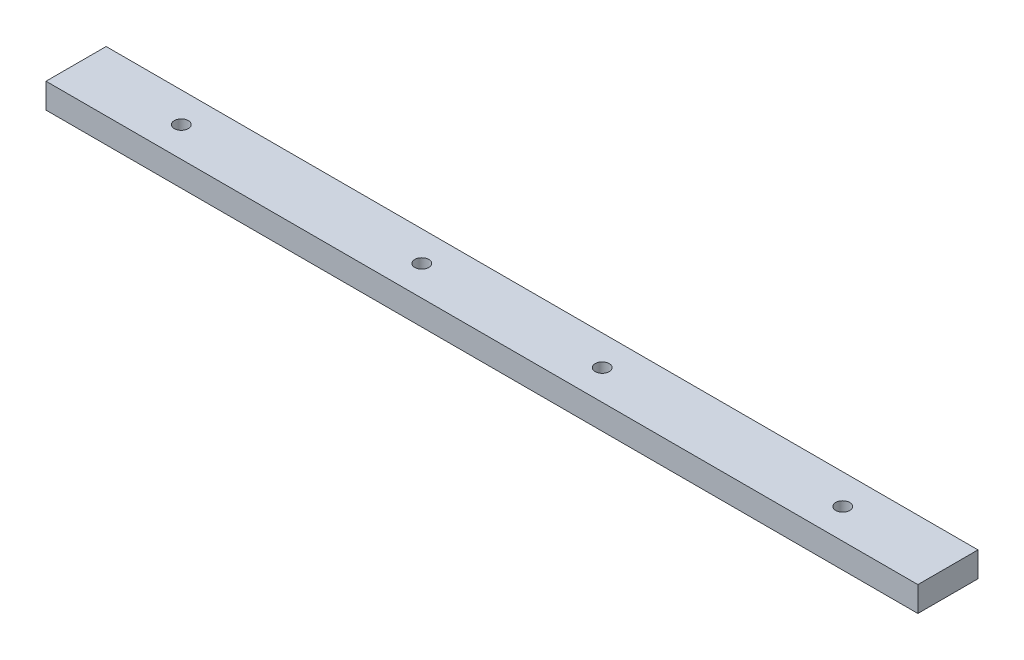
ISO-10303-21;
HEADER;
FILE_DESCRIPTION(('STEP AP214'),'2;1');
FILE_NAME('part.step','',(''),(''),'','','');
FILE_SCHEMA(('AUTOMOTIVE_DESIGN { 1 0 10303 214 1 1 1 1 }'));
ENDSEC;
DATA;
#1=APPLICATION_CONTEXT('core data for automotive mechanical design processes');
#2=APPLICATION_PROTOCOL_DEFINITION('international standard','automotive_design',2000,#1);
#3=PRODUCT_CONTEXT('',#1,'mechanical');
#4=PRODUCT('Part','Part','',(#3));
#5=PRODUCT_RELATED_PRODUCT_CATEGORY('part','',(#4));
#6=PRODUCT_DEFINITION_FORMATION('','',#4);
#7=PRODUCT_DEFINITION_CONTEXT('part definition',#1,'design');
#8=PRODUCT_DEFINITION('design','',#6,#7);
#9=PRODUCT_DEFINITION_SHAPE('','',#8);
#10=(LENGTH_UNIT() NAMED_UNIT(*) SI_UNIT(.MILLI.,.METRE.));
#11=(NAMED_UNIT(*) PLANE_ANGLE_UNIT() SI_UNIT($,.RADIAN.));
#12=(NAMED_UNIT(*) SI_UNIT($,.STERADIAN.) SOLID_ANGLE_UNIT());
#13=UNCERTAINTY_MEASURE_WITH_UNIT(LENGTH_MEASURE(1.E-05),#10,'distance_accuracy_value','');
#14=(GEOMETRIC_REPRESENTATION_CONTEXT(3) GLOBAL_UNCERTAINTY_ASSIGNED_CONTEXT((#13)) GLOBAL_UNIT_ASSIGNED_CONTEXT((#10,
#11,#12)) REPRESENTATION_CONTEXT('',''));
#15=CARTESIAN_POINT('',(0.,0.,0.));
#16=DIRECTION('',(0.,0.,1.));
#17=DIRECTION('',(1.,0.,0.));
#18=AXIS2_PLACEMENT_3D('',#15,#16,#17);
#19=CARTESIAN_POINT('',(0.,5.,0.));
#20=DIRECTION('',(0.,1.,0.));
#21=DIRECTION('',(0.,0.,1.));
#22=AXIS2_PLACEMENT_3D('',#19,#20,#21);
#23=PLANE('',#22);
#24=CARTESIAN_POINT('',(18.,5.,0.));
#25=DIRECTION('',(0.,1.,0.));
#26=DIRECTION('',(0.,0.,1.));
#27=AXIS2_PLACEMENT_3D('',#24,#25,#26);
#28=CIRCLE('',#27,1.4);
#29=CARTESIAN_POINT('',(18.,5.,1.39999999999999));
#30=VERTEX_POINT('',#29);
#31=EDGE_CURVE('E142',#30,#30,#28,.T.);
#32=ORIENTED_EDGE('',*,*,#31,.F.);
#33=EDGE_LOOP('',(#32));
#34=FACE_BOUND('',#33,.T.);
#35=CARTESIAN_POINT('',(-66.,5.,0.));
#36=DIRECTION('',(0.,1.,0.));
#37=DIRECTION('',(0.,0.,1.));
#38=AXIS2_PLACEMENT_3D('',#35,#36,#37);
#39=CIRCLE('',#38,1.4);
#40=CARTESIAN_POINT('',(-66.,5.,1.4));
#41=VERTEX_POINT('',#40);
#42=EDGE_CURVE('E112',#41,#41,#39,.T.);
#43=ORIENTED_EDGE('',*,*,#42,.F.);
#44=EDGE_LOOP('',(#43));
#45=FACE_BOUND('',#44,.T.);
#46=DIRECTION('',(0.,0.,-1.));
#47=VECTOR('',#46,1.);
#48=CARTESIAN_POINT('',(87.,5.,-6.));
#49=LINE('',#48,#47);
#50=CARTESIAN_POINT('',(87.,5.,6.));
#51=VERTEX_POINT('',#50);
#52=CARTESIAN_POINT('',(87.,5.,-6.));
#53=VERTEX_POINT('',#52);
#54=EDGE_CURVE('E92',#51,#53,#49,.T.);
#55=ORIENTED_EDGE('',*,*,#54,.T.);
#56=DIRECTION('',(-1.,0.,0.));
#57=VECTOR('',#56,1.);
#58=CARTESIAN_POINT('',(-87.,5.,-6.));
#59=LINE('',#58,#57);
#60=CARTESIAN_POINT('',(-87.,5.,-6.));
#61=VERTEX_POINT('',#60);
#62=EDGE_CURVE('E87',#53,#61,#59,.T.);
#63=ORIENTED_EDGE('',*,*,#62,.T.);
#64=DIRECTION('',(0.,0.,1.));
#65=VECTOR('',#64,1.);
#66=CARTESIAN_POINT('',(-87.,5.,-6.));
#67=LINE('',#66,#65);
#68=CARTESIAN_POINT('',(-87.,5.,6.));
#69=VERTEX_POINT('',#68);
#70=EDGE_CURVE('E90',#61,#69,#67,.T.);
#71=ORIENTED_EDGE('',*,*,#70,.T.);
#72=DIRECTION('',(1.,0.,0.));
#73=VECTOR('',#72,1.);
#74=CARTESIAN_POINT('',(-87.,5.,6.));
#75=LINE('',#74,#73);
#76=EDGE_CURVE('E57',#69,#51,#75,.T.);
#77=ORIENTED_EDGE('',*,*,#76,.T.);
#78=EDGE_LOOP('',(#55,#63,#71,#77));
#79=FACE_BOUND('',#78,.T.);
#80=CARTESIAN_POINT('',(-18.,5.,0.));
#81=DIRECTION('',(0.,1.,0.));
#82=DIRECTION('',(0.,0.,1.));
#83=AXIS2_PLACEMENT_3D('',#80,#81,#82);
#84=CIRCLE('',#83,1.4);
#85=CARTESIAN_POINT('',(-18.,5.,1.4));
#86=VERTEX_POINT('',#85);
#87=EDGE_CURVE('E134',#86,#86,#84,.T.);
#88=ORIENTED_EDGE('',*,*,#87,.F.);
#89=EDGE_LOOP('',(#88));
#90=FACE_BOUND('',#89,.T.);
#91=CARTESIAN_POINT('',(66.,5.,0.));
#92=DIRECTION('',(0.,1.,0.));
#93=DIRECTION('',(0.,0.,1.));
#94=AXIS2_PLACEMENT_3D('',#91,#92,#93);
#95=CIRCLE('',#94,1.4);
#96=CARTESIAN_POINT('',(66.,5.,1.4));
#97=VERTEX_POINT('',#96);
#98=EDGE_CURVE('E150',#97,#97,#95,.T.);
#99=ORIENTED_EDGE('',*,*,#98,.F.);
#100=EDGE_LOOP('',(#99));
#101=FACE_BOUND('',#100,.T.);
#102=ADVANCED_FACE('F39',(#34,#45,#79,#90,#101),#23,.T.);
#103=CARTESIAN_POINT('',(0.,0.,0.));
#104=DIRECTION('',(0.,1.,0.));
#105=DIRECTION('',(0.,0.,1.));
#106=AXIS2_PLACEMENT_3D('',#103,#104,#105);
#107=PLANE('',#106);
#108=DIRECTION('',(0.,0.,-1.));
#109=VECTOR('',#108,1.);
#110=CARTESIAN_POINT('',(87.,0.,-6.));
#111=LINE('',#110,#109);
#112=CARTESIAN_POINT('',(87.,0.,6.));
#113=VERTEX_POINT('',#112);
#114=CARTESIAN_POINT('',(87.,0.,-6.));
#115=VERTEX_POINT('',#114);
#116=EDGE_CURVE('E108',#113,#115,#111,.T.);
#117=ORIENTED_EDGE('',*,*,#116,.F.);
#118=DIRECTION('',(1.,0.,0.));
#119=VECTOR('',#118,1.);
#120=CARTESIAN_POINT('',(-87.,0.,6.));
#121=LINE('',#120,#119);
#122=CARTESIAN_POINT('',(-87.,0.,6.));
#123=VERTEX_POINT('',#122);
#124=EDGE_CURVE('E80',#123,#113,#121,.T.);
#125=ORIENTED_EDGE('',*,*,#124,.F.);
#126=DIRECTION('',(0.,0.,1.));
#127=VECTOR('',#126,1.);
#128=CARTESIAN_POINT('',(-87.,0.,-6.));
#129=LINE('',#128,#127);
#130=CARTESIAN_POINT('',(-87.,0.,-6.));
#131=VERTEX_POINT('',#130);
#132=EDGE_CURVE('E74',#131,#123,#129,.T.);
#133=ORIENTED_EDGE('',*,*,#132,.F.);
#134=DIRECTION('',(-1.,0.,0.));
#135=VECTOR('',#134,1.);
#136=CARTESIAN_POINT('',(-87.,0.,-6.));
#137=LINE('',#136,#135);
#138=EDGE_CURVE('E97',#115,#131,#137,.T.);
#139=ORIENTED_EDGE('',*,*,#138,.F.);
#140=EDGE_LOOP('',(#117,#125,#133,#139));
#141=FACE_BOUND('',#140,.T.);
#142=CARTESIAN_POINT('',(-66.,0.,0.));
#143=DIRECTION('',(0.,1.,0.));
#144=DIRECTION('',(0.,0.,1.));
#145=AXIS2_PLACEMENT_3D('',#142,#143,#144);
#146=CIRCLE('',#145,1.4);
#147=CARTESIAN_POINT('',(-66.,0.,1.4));
#148=VERTEX_POINT('',#147);
#149=EDGE_CURVE('E130',#148,#148,#146,.T.);
#150=ORIENTED_EDGE('',*,*,#149,.T.);
#151=EDGE_LOOP('',(#150));
#152=FACE_BOUND('',#151,.T.);
#153=CARTESIAN_POINT('',(-18.,0.,0.));
#154=DIRECTION('',(0.,1.,0.));
#155=DIRECTION('',(0.,0.,1.));
#156=AXIS2_PLACEMENT_3D('',#153,#154,#155);
#157=CIRCLE('',#156,1.4);
#158=CARTESIAN_POINT('',(-18.,0.,1.4));
#159=VERTEX_POINT('',#158);
#160=EDGE_CURVE('E138',#159,#159,#157,.T.);
#161=ORIENTED_EDGE('',*,*,#160,.T.);
#162=EDGE_LOOP('',(#161));
#163=FACE_BOUND('',#162,.T.);
#164=CARTESIAN_POINT('',(18.,0.,0.));
#165=DIRECTION('',(0.,1.,0.));
#166=DIRECTION('',(0.,0.,1.));
#167=AXIS2_PLACEMENT_3D('',#164,#165,#166);
#168=CIRCLE('',#167,1.4);
#169=CARTESIAN_POINT('',(18.,0.,1.39999999999999));
#170=VERTEX_POINT('',#169);
#171=EDGE_CURVE('E146',#170,#170,#168,.T.);
#172=ORIENTED_EDGE('',*,*,#171,.T.);
#173=EDGE_LOOP('',(#172));
#174=FACE_BOUND('',#173,.T.);
#175=CARTESIAN_POINT('',(66.,0.,0.));
#176=DIRECTION('',(0.,1.,0.));
#177=DIRECTION('',(0.,0.,1.));
#178=AXIS2_PLACEMENT_3D('',#175,#176,#177);
#179=CIRCLE('',#178,1.4);
#180=CARTESIAN_POINT('',(66.,0.,1.4));
#181=VERTEX_POINT('',#180);
#182=EDGE_CURVE('E154',#181,#181,#179,.T.);
#183=ORIENTED_EDGE('',*,*,#182,.T.);
#184=EDGE_LOOP('',(#183));
#185=FACE_BOUND('',#184,.T.);
#186=ADVANCED_FACE('F125',(#141,#152,#163,#174,#185),#107,.F.);
#187=CARTESIAN_POINT('',(87.,5.,-6.));
#188=DIRECTION('',(-1.,0.,0.));
#189=DIRECTION('',(0.,0.,1.));
#190=AXIS2_PLACEMENT_3D('',#187,#188,#189);
#191=PLANE('',#190);
#192=ORIENTED_EDGE('',*,*,#116,.T.);
#193=DIRECTION('',(0.,-1.,0.));
#194=VECTOR('',#193,1.);
#195=CARTESIAN_POINT('',(87.,5.,-6.));
#196=LINE('',#195,#194);
#197=EDGE_CURVE('E11',#53,#115,#196,.T.);
#198=ORIENTED_EDGE('',*,*,#197,.F.);
#199=ORIENTED_EDGE('',*,*,#54,.F.);
#200=DIRECTION('',(0.,-1.,0.));
#201=VECTOR('',#200,1.);
#202=CARTESIAN_POINT('',(87.,5.,6.));
#203=LINE('',#202,#201);
#204=EDGE_CURVE('E104',#51,#113,#203,.T.);
#205=ORIENTED_EDGE('',*,*,#204,.T.);
#206=EDGE_LOOP('',(#192,#198,#199,#205));
#207=FACE_BOUND('',#206,.T.);
#208=ADVANCED_FACE('F41',(#207),#191,.F.);
#209=CARTESIAN_POINT('',(-87.,5.,-6.));
#210=DIRECTION('',(0.,0.,1.));
#211=DIRECTION('',(1.,0.,0.));
#212=AXIS2_PLACEMENT_3D('',#209,#210,#211);
#213=PLANE('',#212);
#214=ORIENTED_EDGE('',*,*,#138,.T.);
#215=DIRECTION('',(0.,-1.,0.));
#216=VECTOR('',#215,1.);
#217=CARTESIAN_POINT('',(-87.,5.,-6.));
#218=LINE('',#217,#216);
#219=EDGE_CURVE('E49',#61,#131,#218,.T.);
#220=ORIENTED_EDGE('',*,*,#219,.F.);
#221=ORIENTED_EDGE('',*,*,#62,.F.);
#222=ORIENTED_EDGE('',*,*,#197,.T.);
#223=EDGE_LOOP('',(#214,#220,#221,#222));
#224=FACE_BOUND('',#223,.T.);
#225=ADVANCED_FACE('F96',(#224),#213,.F.);
#226=CARTESIAN_POINT('',(-87.,5.,-6.));
#227=DIRECTION('',(1.,0.,0.));
#228=DIRECTION('',(0.,0.,-1.));
#229=AXIS2_PLACEMENT_3D('',#226,#227,#228);
#230=PLANE('',#229);
#231=ORIENTED_EDGE('',*,*,#132,.T.);
#232=DIRECTION('',(0.,-1.,0.));
#233=VECTOR('',#232,1.);
#234=CARTESIAN_POINT('',(-87.,5.,6.));
#235=LINE('',#234,#233);
#236=EDGE_CURVE('E99',#69,#123,#235,.T.);
#237=ORIENTED_EDGE('',*,*,#236,.F.);
#238=ORIENTED_EDGE('',*,*,#70,.F.);
#239=ORIENTED_EDGE('',*,*,#219,.T.);
#240=EDGE_LOOP('',(#231,#237,#238,#239));
#241=FACE_BOUND('',#240,.T.);
#242=ADVANCED_FACE('F100',(#241),#230,.F.);
#243=CARTESIAN_POINT('',(-87.,5.,6.));
#244=DIRECTION('',(0.,0.,-1.));
#245=DIRECTION('',(-1.,0.,0.));
#246=AXIS2_PLACEMENT_3D('',#243,#244,#245);
#247=PLANE('',#246);
#248=ORIENTED_EDGE('',*,*,#124,.T.);
#249=ORIENTED_EDGE('',*,*,#204,.F.);
#250=ORIENTED_EDGE('',*,*,#76,.F.);
#251=ORIENTED_EDGE('',*,*,#236,.T.);
#252=EDGE_LOOP('',(#248,#249,#250,#251));
#253=FACE_BOUND('',#252,.T.);
#254=ADVANCED_FACE('F122',(#253),#247,.F.);
#255=CARTESIAN_POINT('',(-66.,5.,0.));
#256=DIRECTION('',(0.,-1.,0.));
#257=DIRECTION('',(0.,0.,-1.));
#258=AXIS2_PLACEMENT_3D('',#255,#256,#257);
#259=CYLINDRICAL_SURFACE('',#258,1.4);
#260=ORIENTED_EDGE('',*,*,#42,.T.);
#261=EDGE_LOOP('',(#260));
#262=FACE_BOUND('',#261,.T.);
#263=ORIENTED_EDGE('',*,*,#149,.F.);
#264=EDGE_LOOP('',(#263));
#265=FACE_BOUND('',#264,.T.);
#266=ADVANCED_FACE('F175',(#262,#265),#259,.F.);
#267=CARTESIAN_POINT('',(-18.,5.,0.));
#268=DIRECTION('',(0.,-1.,0.));
#269=DIRECTION('',(0.,0.,-1.));
#270=AXIS2_PLACEMENT_3D('',#267,#268,#269);
#271=CYLINDRICAL_SURFACE('',#270,1.4);
#272=ORIENTED_EDGE('',*,*,#87,.T.);
#273=EDGE_LOOP('',(#272));
#274=FACE_BOUND('',#273,.T.);
#275=ORIENTED_EDGE('',*,*,#160,.F.);
#276=EDGE_LOOP('',(#275));
#277=FACE_BOUND('',#276,.T.);
#278=ADVANCED_FACE('F221',(#274,#277),#271,.F.);
#279=CARTESIAN_POINT('',(18.,5.,0.));
#280=DIRECTION('',(0.,-1.,0.));
#281=DIRECTION('',(0.,0.,-1.));
#282=AXIS2_PLACEMENT_3D('',#279,#280,#281);
#283=CYLINDRICAL_SURFACE('',#282,1.4);
#284=ORIENTED_EDGE('',*,*,#31,.T.);
#285=EDGE_LOOP('',(#284));
#286=FACE_BOUND('',#285,.T.);
#287=ORIENTED_EDGE('',*,*,#171,.F.);
#288=EDGE_LOOP('',(#287));
#289=FACE_BOUND('',#288,.T.);
#290=ADVANCED_FACE('F229',(#286,#289),#283,.F.);
#291=CARTESIAN_POINT('',(66.,5.,0.));
#292=DIRECTION('',(0.,-1.,0.));
#293=DIRECTION('',(0.,0.,-1.));
#294=AXIS2_PLACEMENT_3D('',#291,#292,#293);
#295=CYLINDRICAL_SURFACE('',#294,1.4);
#296=ORIENTED_EDGE('',*,*,#98,.T.);
#297=EDGE_LOOP('',(#296));
#298=FACE_BOUND('',#297,.T.);
#299=ORIENTED_EDGE('',*,*,#182,.F.);
#300=EDGE_LOOP('',(#299));
#301=FACE_BOUND('',#300,.T.);
#302=ADVANCED_FACE('F162',(#298,#301),#295,.F.);
#303=CLOSED_SHELL('',(#102,#186,#208,#225,#242,#254,#266,#278,#290,#302));
#304=MANIFOLD_SOLID_BREP('B2',#303);
#305=ADVANCED_BREP_SHAPE_REPRESENTATION('',(#18,#304),#14);
#306=SHAPE_DEFINITION_REPRESENTATION(#9,#305);
ENDSEC;
END-ISO-10303-21;
